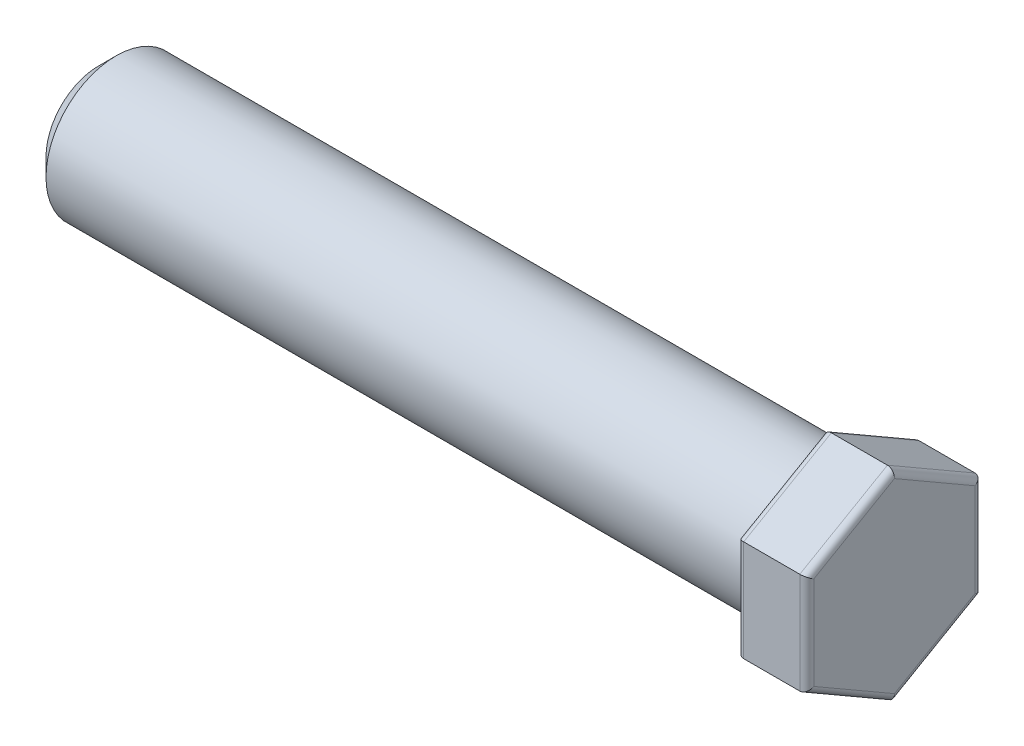
ISO-10303-21;
HEADER;
FILE_DESCRIPTION(('STEP AP214'),'2;1');
FILE_NAME('part.step','',(''),(''),'','','');
FILE_SCHEMA(('AUTOMOTIVE_DESIGN { 1 0 10303 214 1 1 1 1 }'));
ENDSEC;
DATA;
#1=APPLICATION_CONTEXT('core data for automotive mechanical design processes');
#2=APPLICATION_PROTOCOL_DEFINITION('international standard','automotive_design',2000,#1);
#3=PRODUCT_CONTEXT('',#1,'mechanical');
#4=PRODUCT('Part','Part','',(#3));
#5=PRODUCT_RELATED_PRODUCT_CATEGORY('part','',(#4));
#6=PRODUCT_DEFINITION_FORMATION('','',#4);
#7=PRODUCT_DEFINITION_CONTEXT('part definition',#1,'design');
#8=PRODUCT_DEFINITION('design','',#6,#7);
#9=PRODUCT_DEFINITION_SHAPE('','',#8);
#10=(LENGTH_UNIT() NAMED_UNIT(*) SI_UNIT(.MILLI.,.METRE.));
#11=(NAMED_UNIT(*) PLANE_ANGLE_UNIT() SI_UNIT($,.RADIAN.));
#12=(NAMED_UNIT(*) SI_UNIT($,.STERADIAN.) SOLID_ANGLE_UNIT());
#13=UNCERTAINTY_MEASURE_WITH_UNIT(LENGTH_MEASURE(1.E-05),#10,'distance_accuracy_value','');
#14=(GEOMETRIC_REPRESENTATION_CONTEXT(3) GLOBAL_UNCERTAINTY_ASSIGNED_CONTEXT((#13)) GLOBAL_UNIT_ASSIGNED_CONTEXT((#10,
#11,#12)) REPRESENTATION_CONTEXT('',''));
#15=CARTESIAN_POINT('',(0.,0.,0.));
#16=DIRECTION('',(0.,0.,1.));
#17=DIRECTION('',(1.,0.,0.));
#18=AXIS2_PLACEMENT_3D('',#15,#16,#17);
#19=CARTESIAN_POINT('',(1.,1.44337567297409,-2.49999999999999));
#20=DIRECTION('',(0.,-0.866025403784443,0.499999999999993));
#21=DIRECTION('',(0.,-0.499999999999993,-0.866025403784443));
#22=AXIS2_PLACEMENT_3D('',#19,#20,#21);
#23=PLANE('',#22);
#24=DIRECTION('',(-1.,0.,0.));
#25=VECTOR('',#24,1.);
#26=CARTESIAN_POINT('',(1.,1.44337567297409,-2.49999999999999));
#27=LINE('',#26,#25);
#28=CARTESIAN_POINT('',(0.8,1.44337567297409,-2.49999999999999));
#29=VERTEX_POINT('',#28);
#30=CARTESIAN_POINT('',(-0.8,1.44337567297409,-2.49999999999999));
#31=VERTEX_POINT('',#30);
#32=EDGE_CURVE('E267',#29,#31,#27,.T.);
#33=ORIENTED_EDGE('',*,*,#32,.T.);
#34=DIRECTION('',(0.,0.499999999999993,0.866025403784443));
#35=VECTOR('',#34,1.);
#36=CARTESIAN_POINT('',(-0.8,1.44337567297409,-2.49999999999999));
#37=LINE('',#36,#35);
#38=CARTESIAN_POINT('',(-0.8,2.88675134594813,0.));
#39=VERTEX_POINT('',#38);
#40=EDGE_CURVE('E226',#31,#39,#37,.T.);
#41=ORIENTED_EDGE('',*,*,#40,.T.);
#42=DIRECTION('',(-1.,0.,0.));
#43=VECTOR('',#42,1.);
#44=CARTESIAN_POINT('',(1.,2.88675134594813,0.));
#45=LINE('',#44,#43);
#46=CARTESIAN_POINT('',(0.8,2.88675134594813,0.));
#47=VERTEX_POINT('',#46);
#48=EDGE_CURVE('E159',#47,#39,#45,.T.);
#49=ORIENTED_EDGE('',*,*,#48,.F.);
#50=DIRECTION('',(0.,0.499999999999993,0.866025403784443));
#51=VECTOR('',#50,1.);
#52=CARTESIAN_POINT('',(0.8,1.44337567297409,-2.49999999999999));
#53=LINE('',#52,#51);
#54=EDGE_CURVE('E223',#47,#29,#53,.F.);
#55=ORIENTED_EDGE('',*,*,#54,.T.);
#56=EDGE_LOOP('',(#33,#41,#49,#55));
#57=FACE_BOUND('',#56,.T.);
#58=ADVANCED_FACE('F44',(#57),#23,.F.);
#59=CARTESIAN_POINT('',(1.,2.88675134594813,0.));
#60=DIRECTION('',(0.,-0.866025403784435,-0.500000000000007));
#61=DIRECTION('',(0.,0.500000000000007,-0.866025403784434));
#62=AXIS2_PLACEMENT_3D('',#59,#60,#61);
#63=PLANE('',#62);
#64=ORIENTED_EDGE('',*,*,#48,.T.);
#65=DIRECTION('',(0.,-0.500000000000007,0.866025403784434));
#66=VECTOR('',#65,1.);
#67=CARTESIAN_POINT('',(-0.8,2.88675134594813,0.));
#68=LINE('',#67,#66);
#69=CARTESIAN_POINT('',(-0.8,1.44337567297404,2.50000000000001));
#70=VERTEX_POINT('',#69);
#71=EDGE_CURVE('E157',#39,#70,#68,.T.);
#72=ORIENTED_EDGE('',*,*,#71,.T.);
#73=DIRECTION('',(-1.,0.,0.));
#74=VECTOR('',#73,1.);
#75=CARTESIAN_POINT('',(1.,1.44337567297404,2.50000000000001));
#76=LINE('',#75,#74);
#77=CARTESIAN_POINT('',(0.8,1.44337567297404,2.50000000000001));
#78=VERTEX_POINT('',#77);
#79=EDGE_CURVE('E138',#78,#70,#76,.T.);
#80=ORIENTED_EDGE('',*,*,#79,.F.);
#81=DIRECTION('',(0.,-0.500000000000007,0.866025403784434));
#82=VECTOR('',#81,1.);
#83=CARTESIAN_POINT('',(0.8,2.88675134594813,0.));
#84=LINE('',#83,#82);
#85=EDGE_CURVE('E154',#78,#47,#84,.F.);
#86=ORIENTED_EDGE('',*,*,#85,.T.);
#87=EDGE_LOOP('',(#64,#72,#80,#86));
#88=FACE_BOUND('',#87,.T.);
#89=ADVANCED_FACE('F152',(#88),#63,.F.);
#90=CARTESIAN_POINT('',(1.,1.44337567297404,2.50000000000001));
#91=DIRECTION('',(0.,0.,-1.));
#92=DIRECTION('',(0.,1.,0.));
#93=AXIS2_PLACEMENT_3D('',#90,#91,#92);
#94=PLANE('',#93);
#95=ORIENTED_EDGE('',*,*,#79,.T.);
#96=DIRECTION('',(0.,-1.,0.));
#97=VECTOR('',#96,1.);
#98=CARTESIAN_POINT('',(-0.8,1.44337567297404,2.50000000000001));
#99=LINE('',#98,#97);
#100=CARTESIAN_POINT('',(-0.8,-1.44337567297409,2.49999999999999));
#101=VERTEX_POINT('',#100);
#102=EDGE_CURVE('E146',#70,#101,#99,.T.);
#103=ORIENTED_EDGE('',*,*,#102,.T.);
#104=DIRECTION('',(-1.,0.,0.));
#105=VECTOR('',#104,1.);
#106=CARTESIAN_POINT('',(1.,-1.44337567297409,2.49999999999999));
#107=LINE('',#106,#105);
#108=CARTESIAN_POINT('',(0.8,-1.44337567297409,2.49999999999999));
#109=VERTEX_POINT('',#108);
#110=EDGE_CURVE('E140',#109,#101,#107,.T.);
#111=ORIENTED_EDGE('',*,*,#110,.F.);
#112=DIRECTION('',(0.,-1.,0.));
#113=VECTOR('',#112,1.);
#114=CARTESIAN_POINT('',(0.8,1.44337567297404,2.50000000000001));
#115=LINE('',#114,#113);
#116=EDGE_CURVE('E135',#109,#78,#115,.F.);
#117=ORIENTED_EDGE('',*,*,#116,.T.);
#118=EDGE_LOOP('',(#95,#103,#111,#117));
#119=FACE_BOUND('',#118,.T.);
#120=ADVANCED_FACE('F137',(#119),#94,.F.);
#121=CARTESIAN_POINT('',(1.,-1.44337567297409,2.49999999999999));
#122=DIRECTION('',(0.,0.866025403784443,-0.499999999999993));
#123=DIRECTION('',(0.,0.499999999999993,0.866025403784443));
#124=AXIS2_PLACEMENT_3D('',#121,#122,#123);
#125=PLANE('',#124);
#126=ORIENTED_EDGE('',*,*,#110,.T.);
#127=DIRECTION('',(0.,-0.499999999999993,-0.866025403784443));
#128=VECTOR('',#127,1.);
#129=CARTESIAN_POINT('',(-0.8,-1.44337567297409,2.49999999999999));
#130=LINE('',#129,#128);
#131=CARTESIAN_POINT('',(-0.8,-2.88675134594813,0.));
#132=VERTEX_POINT('',#131);
#133=EDGE_CURVE('E207',#101,#132,#130,.T.);
#134=ORIENTED_EDGE('',*,*,#133,.T.);
#135=DIRECTION('',(-1.,0.,0.));
#136=VECTOR('',#135,1.);
#137=CARTESIAN_POINT('',(1.,-2.88675134594813,0.));
#138=LINE('',#137,#136);
#139=CARTESIAN_POINT('',(0.8,-2.88675134594813,0.));
#140=VERTEX_POINT('',#139);
#141=EDGE_CURVE('E577',#140,#132,#138,.T.);
#142=ORIENTED_EDGE('',*,*,#141,.F.);
#143=DIRECTION('',(0.,-0.499999999999993,-0.866025403784443));
#144=VECTOR('',#143,1.);
#145=CARTESIAN_POINT('',(0.8,-1.44337567297409,2.49999999999999));
#146=LINE('',#145,#144);
#147=EDGE_CURVE('E204',#140,#109,#146,.F.);
#148=ORIENTED_EDGE('',*,*,#147,.T.);
#149=EDGE_LOOP('',(#126,#134,#142,#148));
#150=FACE_BOUND('',#149,.T.);
#151=ADVANCED_FACE('F528',(#150),#125,.F.);
#152=CARTESIAN_POINT('',(1.,-2.88675134594813,0.));
#153=DIRECTION('',(0.,0.866025403784434,0.500000000000008));
#154=DIRECTION('',(0.,-0.500000000000008,0.866025403784434));
#155=AXIS2_PLACEMENT_3D('',#152,#153,#154);
#156=PLANE('',#155);
#157=ORIENTED_EDGE('',*,*,#141,.T.);
#158=DIRECTION('',(0.,0.500000000000008,-0.866025403784434));
#159=VECTOR('',#158,1.);
#160=CARTESIAN_POINT('',(-0.8,-2.88675134594813,0.));
#161=LINE('',#160,#159);
#162=CARTESIAN_POINT('',(-0.8,-1.44337567297404,-2.50000000000001));
#163=VERTEX_POINT('',#162);
#164=EDGE_CURVE('E213',#132,#163,#161,.T.);
#165=ORIENTED_EDGE('',*,*,#164,.T.);
#166=DIRECTION('',(-1.,0.,0.));
#167=VECTOR('',#166,1.);
#168=CARTESIAN_POINT('',(1.,-1.44337567297404,-2.50000000000001));
#169=LINE('',#168,#167);
#170=CARTESIAN_POINT('',(0.8,-1.44337567297404,-2.50000000000001));
#171=VERTEX_POINT('',#170);
#172=EDGE_CURVE('E598',#171,#163,#169,.T.);
#173=ORIENTED_EDGE('',*,*,#172,.F.);
#174=DIRECTION('',(0.,0.500000000000008,-0.866025403784434));
#175=VECTOR('',#174,1.);
#176=CARTESIAN_POINT('',(0.8,-2.88675134594813,0.));
#177=LINE('',#176,#175);
#178=EDGE_CURVE('E210',#171,#140,#177,.F.);
#179=ORIENTED_EDGE('',*,*,#178,.T.);
#180=EDGE_LOOP('',(#157,#165,#173,#179));
#181=FACE_BOUND('',#180,.T.);
#182=ADVANCED_FACE('F518',(#181),#156,.F.);
#183=CARTESIAN_POINT('',(1.,-1.44337567297404,-2.50000000000001));
#184=DIRECTION('',(0.,0.,1.));
#185=DIRECTION('',(0.,-1.,0.));
#186=AXIS2_PLACEMENT_3D('',#183,#184,#185);
#187=PLANE('',#186);
#188=ORIENTED_EDGE('',*,*,#172,.T.);
#189=DIRECTION('',(0.,1.,0.));
#190=VECTOR('',#189,1.);
#191=CARTESIAN_POINT('',(-0.8,-1.44337567297404,-2.50000000000001));
#192=LINE('',#191,#190);
#193=EDGE_CURVE('E220',#163,#31,#192,.T.);
#194=ORIENTED_EDGE('',*,*,#193,.T.);
#195=ORIENTED_EDGE('',*,*,#32,.F.);
#196=DIRECTION('',(0.,1.,0.));
#197=VECTOR('',#196,1.);
#198=CARTESIAN_POINT('',(0.8,-1.44337567297404,-2.50000000000001));
#199=LINE('',#198,#197);
#200=EDGE_CURVE('E216',#29,#171,#199,.F.);
#201=ORIENTED_EDGE('',*,*,#200,.T.);
#202=EDGE_LOOP('',(#188,#194,#195,#201));
#203=FACE_BOUND('',#202,.T.);
#204=ADVANCED_FACE('F511',(#203),#187,.F.);
#205=CARTESIAN_POINT('',(1.,0.,0.));
#206=DIRECTION('',(1.,0.,0.));
#207=DIRECTION('',(0.,0.,-1.));
#208=AXIS2_PLACEMENT_3D('',#205,#206,#207);
#209=PLANE('',#208);
#210=DIRECTION('',(0.,0.500000000000008,-0.866025403784434));
#211=VECTOR('',#210,1.);
#212=CARTESIAN_POINT('',(1.,-1.27017059221715,-2.40000000000001));
#213=LINE('',#212,#211);
#214=CARTESIAN_POINT('',(1.,-2.65581123827228,0.));
#215=VERTEX_POINT('',#214);
#216=CARTESIAN_POINT('',(1.,-1.32790561913612,-2.30000000000001));
#217=VERTEX_POINT('',#216);
#218=EDGE_CURVE('E60',#215,#217,#213,.T.);
#219=ORIENTED_EDGE('',*,*,#218,.T.);
#220=DIRECTION('',(0.,1.,0.));
#221=VECTOR('',#220,1.);
#222=CARTESIAN_POINT('',(1.,1.44337567297408,-2.29999999999999));
#223=LINE('',#222,#221);
#224=CARTESIAN_POINT('',(1.,1.32790561913616,-2.29999999999999));
#225=VERTEX_POINT('',#224);
#226=EDGE_CURVE('E241',#217,#225,#223,.T.);
#227=ORIENTED_EDGE('',*,*,#226,.T.);
#228=DIRECTION('',(0.,0.499999999999993,0.866025403784443));
#229=VECTOR('',#228,1.);
#230=CARTESIAN_POINT('',(1.,2.71354626519124,0.100000000000023));
#231=LINE('',#230,#229);
#232=CARTESIAN_POINT('',(1.,2.65581123827228,0.));
#233=VERTEX_POINT('',#232);
#234=EDGE_CURVE('E229',#225,#233,#231,.T.);
#235=ORIENTED_EDGE('',*,*,#234,.T.);
#236=DIRECTION('',(0.,-0.500000000000007,0.866025403784434));
#237=VECTOR('',#236,1.);
#238=CARTESIAN_POINT('',(1.,1.27017059221716,2.40000000000001));
#239=LINE('',#238,#237);
#240=CARTESIAN_POINT('',(1.,1.32790561913612,2.30000000000001));
#241=VERTEX_POINT('',#240);
#242=EDGE_CURVE('E232',#233,#241,#239,.T.);
#243=ORIENTED_EDGE('',*,*,#242,.T.);
#244=DIRECTION('',(0.,-1.,0.));
#245=VECTOR('',#244,1.);
#246=CARTESIAN_POINT('',(1.,-1.44337567297408,2.29999999999999));
#247=LINE('',#246,#245);
#248=CARTESIAN_POINT('',(1.,-1.32790561913616,2.29999999999999));
#249=VERTEX_POINT('',#248);
#250=EDGE_CURVE('E165',#241,#249,#247,.T.);
#251=ORIENTED_EDGE('',*,*,#250,.T.);
#252=DIRECTION('',(0.,-0.499999999999993,-0.866025403784443));
#253=VECTOR('',#252,1.);
#254=CARTESIAN_POINT('',(1.,-2.71354626519124,-0.100000000000022));
#255=LINE('',#254,#253);
#256=EDGE_CURVE('E65',#249,#215,#255,.T.);
#257=ORIENTED_EDGE('',*,*,#256,.T.);
#258=EDGE_LOOP('',(#219,#227,#235,#243,#251,#257));
#259=FACE_BOUND('',#258,.T.);
#260=ADVANCED_FACE('F411',(#259),#209,.T.);
#261=CARTESIAN_POINT('',(-1.,0.,0.));
#262=DIRECTION('',(1.,0.,0.));
#263=DIRECTION('',(0.,0.,-1.));
#264=AXIS2_PLACEMENT_3D('',#261,#262,#263);
#265=PLANE('',#264);
#266=CARTESIAN_POINT('',(-1.,0.,0.));
#267=DIRECTION('',(1.,0.,0.));
#268=DIRECTION('',(0.,0.,-1.));
#269=AXIS2_PLACEMENT_3D('',#266,#267,#268);
#270=CIRCLE('',#269,2.2);
#271=CARTESIAN_POINT('',(-1.,0.,-2.2));
#272=VERTEX_POINT('',#271);
#273=EDGE_CURVE('E11',#272,#272,#270,.T.);
#274=ORIENTED_EDGE('',*,*,#273,.T.);
#275=EDGE_LOOP('',(#274));
#276=FACE_BOUND('',#275,.T.);
#277=DIRECTION('',(0.,-1.,0.));
#278=VECTOR('',#277,1.);
#279=CARTESIAN_POINT('',(-1.,0.,2.3));
#280=LINE('',#279,#278);
#281=CARTESIAN_POINT('',(-1.,-1.32790561913616,2.29999999999999));
#282=VERTEX_POINT('',#281);
#283=CARTESIAN_POINT('',(-1.,1.32790561913612,2.30000000000001));
#284=VERTEX_POINT('',#283);
#285=EDGE_CURVE('E196',#282,#284,#280,.F.);
#286=ORIENTED_EDGE('',*,*,#285,.T.);
#287=DIRECTION('',(0.,-0.500000000000007,0.866025403784434));
#288=VECTOR('',#287,1.);
#289=CARTESIAN_POINT('',(-1.,1.9918584287042,1.15000000000002));
#290=LINE('',#289,#288);
#291=CARTESIAN_POINT('',(-1.,2.65581123827228,0.));
#292=VERTEX_POINT('',#291);
#293=EDGE_CURVE('E147',#284,#292,#290,.F.);
#294=ORIENTED_EDGE('',*,*,#293,.T.);
#295=DIRECTION('',(0.,0.499999999999993,0.866025403784443));
#296=VECTOR('',#295,1.);
#297=CARTESIAN_POINT('',(-1.,1.99185842870422,-1.14999999999998));
#298=LINE('',#297,#296);
#299=CARTESIAN_POINT('',(-1.,1.32790561913616,-2.29999999999999));
#300=VERTEX_POINT('',#299);
#301=EDGE_CURVE('E181',#292,#300,#298,.F.);
#302=ORIENTED_EDGE('',*,*,#301,.T.);
#303=DIRECTION('',(0.,1.,0.));
#304=VECTOR('',#303,1.);
#305=CARTESIAN_POINT('',(-1.,0.,-2.3));
#306=LINE('',#305,#304);
#307=CARTESIAN_POINT('',(-1.,-1.32790561913612,-2.30000000000001));
#308=VERTEX_POINT('',#307);
#309=EDGE_CURVE('E187',#300,#308,#306,.F.);
#310=ORIENTED_EDGE('',*,*,#309,.T.);
#311=DIRECTION('',(0.,0.500000000000008,-0.866025403784434));
#312=VECTOR('',#311,1.);
#313=CARTESIAN_POINT('',(-1.,-1.9918584287042,-1.15000000000002));
#314=LINE('',#313,#312);
#315=CARTESIAN_POINT('',(-1.,-2.65581123827228,0.));
#316=VERTEX_POINT('',#315);
#317=EDGE_CURVE('E190',#308,#316,#314,.F.);
#318=ORIENTED_EDGE('',*,*,#317,.T.);
#319=DIRECTION('',(0.,-0.499999999999993,-0.866025403784443));
#320=VECTOR('',#319,1.);
#321=CARTESIAN_POINT('',(-1.,-1.99185842870422,1.14999999999998));
#322=LINE('',#321,#320);
#323=EDGE_CURVE('E193',#316,#282,#322,.F.);
#324=ORIENTED_EDGE('',*,*,#323,.T.);
#325=EDGE_LOOP('',(#286,#294,#302,#310,#318,#324));
#326=FACE_BOUND('',#325,.T.);
#327=ADVANCED_FACE('F336',(#276,#326),#265,.F.);
#328=CARTESIAN_POINT('',(-0.8,-2.71354626519124,0.0999999999999777));
#329=DIRECTION('',(0.,0.500000000000008,-0.866025403784434));
#330=DIRECTION('',(0.,0.866025403784434,0.500000000000008));
#331=AXIS2_PLACEMENT_3D('',#328,#329,#330);
#332=CYLINDRICAL_SURFACE('',#331,0.2);
#333=CARTESIAN_POINT('',(-0.8,-2.65581123827228,0.));
#334=DIRECTION('',(0.,0.,-1.));
#335=DIRECTION('',(0.,1.,0.));
#336=AXIS2_PLACEMENT_3D('',#333,#334,#335);
#337=ELLIPSE('',#336,0.23094010767585,0.2);
#338=EDGE_CURVE('E259',#316,#132,#337,.F.);
#339=ORIENTED_EDGE('',*,*,#338,.F.);
#340=ORIENTED_EDGE('',*,*,#317,.F.);
#341=CARTESIAN_POINT('',(-0.8,-1.32790561913612,-2.30000000000001));
#342=DIRECTION('',(0.,0.866025403784443,-0.499999999999992));
#343=DIRECTION('',(0.,0.499999999999992,0.866025403784443));
#344=AXIS2_PLACEMENT_3D('',#341,#342,#343);
#345=ELLIPSE('',#344,0.23094010767585,0.2);
#346=EDGE_CURVE('E263',#163,#308,#345,.T.);
#347=ORIENTED_EDGE('',*,*,#346,.F.);
#348=ORIENTED_EDGE('',*,*,#164,.F.);
#349=EDGE_LOOP('',(#339,#340,#347,#348));
#350=FACE_BOUND('',#349,.T.);
#351=ADVANCED_FACE('F332',(#350),#332,.T.);
#352=CARTESIAN_POINT('',(-0.8,-1.44337567297404,-2.30000000000001));
#353=DIRECTION('',(0.,1.,0.));
#354=DIRECTION('',(0.,0.,1.));
#355=AXIS2_PLACEMENT_3D('',#352,#353,#354);
#356=CYLINDRICAL_SURFACE('',#355,0.2);
#357=ORIENTED_EDGE('',*,*,#346,.T.);
#358=ORIENTED_EDGE('',*,*,#309,.F.);
#359=CARTESIAN_POINT('',(-0.8,1.32790561913616,-2.29999999999999));
#360=DIRECTION('',(0.,0.866025403784434,0.500000000000007));
#361=DIRECTION('',(0.,-0.500000000000007,0.866025403784434));
#362=AXIS2_PLACEMENT_3D('',#359,#360,#361);
#363=ELLIPSE('',#362,0.23094010767585,0.2);
#364=EDGE_CURVE('E255',#31,#300,#363,.T.);
#365=ORIENTED_EDGE('',*,*,#364,.F.);
#366=ORIENTED_EDGE('',*,*,#193,.F.);
#367=EDGE_LOOP('',(#357,#358,#365,#366));
#368=FACE_BOUND('',#367,.T.);
#369=ADVANCED_FACE('F328',(#368),#356,.T.);
#370=CARTESIAN_POINT('',(-0.8,-1.2701705922172,2.39999999999999));
#371=DIRECTION('',(0.,-0.499999999999993,-0.866025403784443));
#372=DIRECTION('',(0.,0.866025403784443,-0.499999999999993));
#373=AXIS2_PLACEMENT_3D('',#370,#371,#372);
#374=CYLINDRICAL_SURFACE('',#373,0.2);
#375=ORIENTED_EDGE('',*,*,#338,.T.);
#376=ORIENTED_EDGE('',*,*,#133,.F.);
#377=CARTESIAN_POINT('',(-0.8,-1.32790561913616,2.29999999999999));
#378=DIRECTION('',(0.,-0.866025403784434,-0.500000000000007));
#379=DIRECTION('',(0.,0.500000000000007,-0.866025403784434));
#380=AXIS2_PLACEMENT_3D('',#377,#378,#379);
#381=ELLIPSE('',#380,0.23094010767585,0.2);
#382=EDGE_CURVE('E251',#282,#101,#381,.F.);
#383=ORIENTED_EDGE('',*,*,#382,.F.);
#384=ORIENTED_EDGE('',*,*,#323,.F.);
#385=EDGE_LOOP('',(#375,#376,#383,#384));
#386=FACE_BOUND('',#385,.T.);
#387=ADVANCED_FACE('F324',(#386),#374,.T.);
#388=CARTESIAN_POINT('',(-0.8,1.2701705922172,-2.39999999999999));
#389=DIRECTION('',(0.,0.499999999999993,0.866025403784443));
#390=DIRECTION('',(0.,-0.866025403784443,0.499999999999993));
#391=AXIS2_PLACEMENT_3D('',#388,#389,#390);
#392=CYLINDRICAL_SURFACE('',#391,0.2);
#393=ORIENTED_EDGE('',*,*,#364,.T.);
#394=ORIENTED_EDGE('',*,*,#301,.F.);
#395=CARTESIAN_POINT('',(-0.8,2.65581123827228,0.));
#396=DIRECTION('',(0.,0.,1.));
#397=DIRECTION('',(0.,1.,0.));
#398=AXIS2_PLACEMENT_3D('',#395,#396,#397);
#399=ELLIPSE('',#398,0.23094010767585,0.2);
#400=EDGE_CURVE('E248',#39,#292,#399,.T.);
#401=ORIENTED_EDGE('',*,*,#400,.F.);
#402=ORIENTED_EDGE('',*,*,#40,.F.);
#403=EDGE_LOOP('',(#393,#394,#401,#402));
#404=FACE_BOUND('',#403,.T.);
#405=ADVANCED_FACE('F320',(#404),#392,.T.);
#406=CARTESIAN_POINT('',(-0.8,1.44337567297405,2.30000000000001));
#407=DIRECTION('',(0.,-1.,0.));
#408=DIRECTION('',(0.,0.,-1.));
#409=AXIS2_PLACEMENT_3D('',#406,#407,#408);
#410=CYLINDRICAL_SURFACE('',#409,0.2);
#411=ORIENTED_EDGE('',*,*,#382,.T.);
#412=ORIENTED_EDGE('',*,*,#102,.F.);
#413=CARTESIAN_POINT('',(-0.8,1.32790561913612,2.30000000000001));
#414=DIRECTION('',(0.,-0.866025403784443,0.499999999999993));
#415=DIRECTION('',(0.,-0.499999999999993,-0.866025403784443));
#416=AXIS2_PLACEMENT_3D('',#413,#414,#415);
#417=ELLIPSE('',#416,0.23094010767585,0.2);
#418=EDGE_CURVE('E245',#284,#70,#417,.F.);
#419=ORIENTED_EDGE('',*,*,#418,.F.);
#420=ORIENTED_EDGE('',*,*,#285,.F.);
#421=EDGE_LOOP('',(#411,#412,#419,#420));
#422=FACE_BOUND('',#421,.T.);
#423=ADVANCED_FACE('F316',(#422),#410,.T.);
#424=CARTESIAN_POINT('',(-0.8,2.71354626519124,-0.0999999999999772));
#425=DIRECTION('',(0.,-0.500000000000007,0.866025403784434));
#426=DIRECTION('',(0.,-0.866025403784435,-0.500000000000007));
#427=AXIS2_PLACEMENT_3D('',#424,#425,#426);
#428=CYLINDRICAL_SURFACE('',#427,0.2);
#429=ORIENTED_EDGE('',*,*,#400,.T.);
#430=ORIENTED_EDGE('',*,*,#293,.F.);
#431=ORIENTED_EDGE('',*,*,#418,.T.);
#432=ORIENTED_EDGE('',*,*,#71,.F.);
#433=EDGE_LOOP('',(#429,#430,#431,#432));
#434=FACE_BOUND('',#433,.T.);
#435=ADVANCED_FACE('F313',(#434),#428,.T.);
#436=CARTESIAN_POINT('',(0.8,0.,2.3));
#437=DIRECTION('',(0.,1.,0.));
#438=DIRECTION('',(0.,0.,1.));
#439=AXIS2_PLACEMENT_3D('',#436,#437,#438);
#440=CYLINDRICAL_SURFACE('',#439,0.2);
#441=CARTESIAN_POINT('',(0.8,1.32790561913612,2.30000000000001));
#442=DIRECTION('',(0.,0.866025403784443,-0.499999999999993));
#443=DIRECTION('',(0.,-0.499999999999993,-0.866025403784443));
#444=AXIS2_PLACEMENT_3D('',#441,#442,#443);
#445=ELLIPSE('',#444,0.23094010767585,0.2);
#446=EDGE_CURVE('E163',#78,#241,#445,.T.);
#447=ORIENTED_EDGE('',*,*,#446,.F.);
#448=ORIENTED_EDGE('',*,*,#116,.F.);
#449=CARTESIAN_POINT('',(0.8,-1.32790561913616,2.29999999999999));
#450=DIRECTION('',(0.,0.866025403784434,0.500000000000007));
#451=DIRECTION('',(0.,0.500000000000007,-0.866025403784434));
#452=AXIS2_PLACEMENT_3D('',#449,#450,#451);
#453=ELLIPSE('',#452,0.23094010767585,0.2);
#454=EDGE_CURVE('E169',#249,#109,#453,.F.);
#455=ORIENTED_EDGE('',*,*,#454,.F.);
#456=ORIENTED_EDGE('',*,*,#250,.F.);
#457=EDGE_LOOP('',(#447,#448,#455,#456));
#458=FACE_BOUND('',#457,.T.);
#459=ADVANCED_FACE('F164',(#458),#440,.T.);
#460=CARTESIAN_POINT('',(0.8,-1.99185842870422,1.14999999999998));
#461=DIRECTION('',(0.,0.499999999999993,0.866025403784443));
#462=DIRECTION('',(0.,-0.866025403784443,0.499999999999993));
#463=AXIS2_PLACEMENT_3D('',#460,#461,#462);
#464=CYLINDRICAL_SURFACE('',#463,0.2);
#465=ORIENTED_EDGE('',*,*,#454,.T.);
#466=ORIENTED_EDGE('',*,*,#147,.F.);
#467=CARTESIAN_POINT('',(0.8,-2.65581123827228,0.));
#468=DIRECTION('',(0.,0.,1.));
#469=DIRECTION('',(0.,1.,0.));
#470=AXIS2_PLACEMENT_3D('',#467,#468,#469);
#471=ELLIPSE('',#470,0.23094010767585,0.2);
#472=EDGE_CURVE('E170',#215,#140,#471,.F.);
#473=ORIENTED_EDGE('',*,*,#472,.F.);
#474=ORIENTED_EDGE('',*,*,#256,.F.);
#475=EDGE_LOOP('',(#465,#466,#473,#474));
#476=FACE_BOUND('',#475,.T.);
#477=ADVANCED_FACE('F352',(#476),#464,.T.);
#478=CARTESIAN_POINT('',(0.8,1.9918584287042,1.15000000000002));
#479=DIRECTION('',(0.,0.500000000000007,-0.866025403784434));
#480=DIRECTION('',(0.,0.866025403784435,0.500000000000007));
#481=AXIS2_PLACEMENT_3D('',#478,#479,#480);
#482=CYLINDRICAL_SURFACE('',#481,0.2);
#483=ORIENTED_EDGE('',*,*,#446,.T.);
#484=ORIENTED_EDGE('',*,*,#242,.F.);
#485=CARTESIAN_POINT('',(0.8,2.65581123827228,0.));
#486=DIRECTION('',(0.,0.,-1.));
#487=DIRECTION('',(0.,-1.,0.));
#488=AXIS2_PLACEMENT_3D('',#485,#486,#487);
#489=ELLIPSE('',#488,0.23094010767585,0.2);
#490=EDGE_CURVE('E175',#47,#233,#489,.T.);
#491=ORIENTED_EDGE('',*,*,#490,.F.);
#492=ORIENTED_EDGE('',*,*,#85,.F.);
#493=EDGE_LOOP('',(#483,#484,#491,#492));
#494=FACE_BOUND('',#493,.T.);
#495=ADVANCED_FACE('F173',(#494),#482,.T.);
#496=CARTESIAN_POINT('',(0.8,-1.9918584287042,-1.15000000000002));
#497=DIRECTION('',(0.,-0.500000000000008,0.866025403784434));
#498=DIRECTION('',(0.,-0.866025403784434,-0.500000000000008));
#499=AXIS2_PLACEMENT_3D('',#496,#497,#498);
#500=CYLINDRICAL_SURFACE('',#499,0.2);
#501=ORIENTED_EDGE('',*,*,#472,.T.);
#502=ORIENTED_EDGE('',*,*,#178,.F.);
#503=CARTESIAN_POINT('',(0.8,-1.32790561913612,-2.30000000000001));
#504=DIRECTION('',(0.,-0.866025403784443,0.499999999999992));
#505=DIRECTION('',(0.,0.499999999999992,0.866025403784443));
#506=AXIS2_PLACEMENT_3D('',#503,#504,#505);
#507=ELLIPSE('',#506,0.23094010767585,0.2);
#508=EDGE_CURVE('E271',#217,#171,#507,.F.);
#509=ORIENTED_EDGE('',*,*,#508,.F.);
#510=ORIENTED_EDGE('',*,*,#218,.F.);
#511=EDGE_LOOP('',(#501,#502,#509,#510));
#512=FACE_BOUND('',#511,.T.);
#513=ADVANCED_FACE('F345',(#512),#500,.T.);
#514=CARTESIAN_POINT('',(0.8,1.99185842870422,-1.14999999999998));
#515=DIRECTION('',(0.,-0.499999999999993,-0.866025403784443));
#516=DIRECTION('',(0.,0.866025403784443,-0.499999999999993));
#517=AXIS2_PLACEMENT_3D('',#514,#515,#516);
#518=CYLINDRICAL_SURFACE('',#517,0.2);
#519=ORIENTED_EDGE('',*,*,#490,.T.);
#520=ORIENTED_EDGE('',*,*,#234,.F.);
#521=CARTESIAN_POINT('',(0.8,1.32790561913616,-2.29999999999999));
#522=DIRECTION('',(0.,-0.866025403784434,-0.500000000000007));
#523=DIRECTION('',(0.,0.500000000000007,-0.866025403784434));
#524=AXIS2_PLACEMENT_3D('',#521,#522,#523);
#525=ELLIPSE('',#524,0.23094010767585,0.2);
#526=EDGE_CURVE('E268',#29,#225,#525,.T.);
#527=ORIENTED_EDGE('',*,*,#526,.F.);
#528=ORIENTED_EDGE('',*,*,#54,.F.);
#529=EDGE_LOOP('',(#519,#520,#527,#528));
#530=FACE_BOUND('',#529,.T.);
#531=ADVANCED_FACE('F341',(#530),#518,.T.);
#532=CARTESIAN_POINT('',(0.8,0.,-2.3));
#533=DIRECTION('',(0.,-1.,0.));
#534=DIRECTION('',(0.,0.,-1.));
#535=AXIS2_PLACEMENT_3D('',#532,#533,#534);
#536=CYLINDRICAL_SURFACE('',#535,0.2);
#537=ORIENTED_EDGE('',*,*,#508,.T.);
#538=ORIENTED_EDGE('',*,*,#200,.F.);
#539=ORIENTED_EDGE('',*,*,#526,.T.);
#540=ORIENTED_EDGE('',*,*,#226,.F.);
#541=EDGE_LOOP('',(#537,#538,#539,#540));
#542=FACE_BOUND('',#541,.T.);
#543=ADVANCED_FACE('F338',(#542),#536,.T.);
#544=CARTESIAN_POINT('',(-21.7,0.,0.));
#545=DIRECTION('',(1.,0.,0.));
#546=DIRECTION('',(0.,0.,-1.));
#547=AXIS2_PLACEMENT_3D('',#544,#545,#546);
#548=CYLINDRICAL_SURFACE('',#547,2.);
#549=CARTESIAN_POINT('',(-1.2,0.,0.));
#550=DIRECTION('',(1.,0.,0.));
#551=DIRECTION('',(0.,0.,-1.));
#552=AXIS2_PLACEMENT_3D('',#549,#550,#551);
#553=CIRCLE('',#552,2.);
#554=CARTESIAN_POINT('',(-1.2,0.,-2.));
#555=VERTEX_POINT('',#554);
#556=EDGE_CURVE('E53',#555,#555,#553,.F.);
#557=ORIENTED_EDGE('',*,*,#556,.T.);
#558=EDGE_LOOP('',(#557));
#559=FACE_BOUND('',#558,.T.);
#560=CARTESIAN_POINT('',(-21.2,0.,0.));
#561=DIRECTION('',(-1.,0.,0.));
#562=DIRECTION('',(0.,0.,1.));
#563=AXIS2_PLACEMENT_3D('',#560,#561,#562);
#564=CIRCLE('',#563,2.);
#565=CARTESIAN_POINT('',(-21.2,0.,2.));
#566=VERTEX_POINT('',#565);
#567=EDGE_CURVE('E284',#566,#566,#564,.F.);
#568=ORIENTED_EDGE('',*,*,#567,.T.);
#569=EDGE_LOOP('',(#568));
#570=FACE_BOUND('',#569,.T.);
#571=ADVANCED_FACE('F291',(#559,#570),#548,.T.);
#572=CARTESIAN_POINT('',(-21.7,0.,0.));
#573=DIRECTION('',(-1.,0.,0.));
#574=DIRECTION('',(0.,0.,1.));
#575=AXIS2_PLACEMENT_3D('',#572,#573,#574);
#576=PLANE('',#575);
#577=CARTESIAN_POINT('',(-21.7,0.,0.));
#578=DIRECTION('',(-1.,0.,0.));
#579=DIRECTION('',(0.,0.,1.));
#580=AXIS2_PLACEMENT_3D('',#577,#578,#579);
#581=CIRCLE('',#580,1.5);
#582=CARTESIAN_POINT('',(-21.7,0.,1.5));
#583=VERTEX_POINT('',#582);
#584=EDGE_CURVE('E244',#583,#583,#581,.T.);
#585=ORIENTED_EDGE('',*,*,#584,.T.);
#586=EDGE_LOOP('',(#585));
#587=FACE_BOUND('',#586,.T.);
#588=ADVANCED_FACE('F300',(#587),#576,.T.);
#589=CARTESIAN_POINT('',(-21.7,0.,0.));
#590=DIRECTION('',(1.,0.,0.));
#591=DIRECTION('',(0.,0.,-1.));
#592=AXIS2_PLACEMENT_3D('',#589,#590,#591);
#593=CONICAL_SURFACE('',#592,1.5,0.785398163397447);
#594=ORIENTED_EDGE('',*,*,#567,.F.);
#595=EDGE_LOOP('',(#594));
#596=FACE_BOUND('',#595,.T.);
#597=ORIENTED_EDGE('',*,*,#584,.F.);
#598=EDGE_LOOP('',(#597));
#599=FACE_BOUND('',#598,.T.);
#600=ADVANCED_FACE('F295',(#596,#599),#593,.T.);
#601=CARTESIAN_POINT('',(-1.2,0.,0.));
#602=DIRECTION('',(1.,0.,0.));
#603=DIRECTION('',(0.,0.,-1.));
#604=AXIS2_PLACEMENT_3D('',#601,#602,#603);
#605=TOROIDAL_SURFACE('',#604,2.2,0.2);
#606=ORIENTED_EDGE('',*,*,#273,.F.);
#607=EDGE_LOOP('',(#606));
#608=FACE_BOUND('',#607,.T.);
#609=ORIENTED_EDGE('',*,*,#556,.F.);
#610=EDGE_LOOP('',(#609));
#611=FACE_BOUND('',#610,.T.);
#612=ADVANCED_FACE('F46',(#608,#611),#605,.F.);
#613=CLOSED_SHELL('',(#58,#89,#120,#151,#182,#204,#260,#327,#351,#369,#387,#405,#423,#435,#459,
#477,#495,#513,#531,#543,#571,#588,#600,#612));
#614=MANIFOLD_SOLID_BREP('B2',#613);
#615=ADVANCED_BREP_SHAPE_REPRESENTATION('',(#18,#614),#14);
#616=SHAPE_DEFINITION_REPRESENTATION(#9,#615);
ENDSEC;
END-ISO-10303-21;
